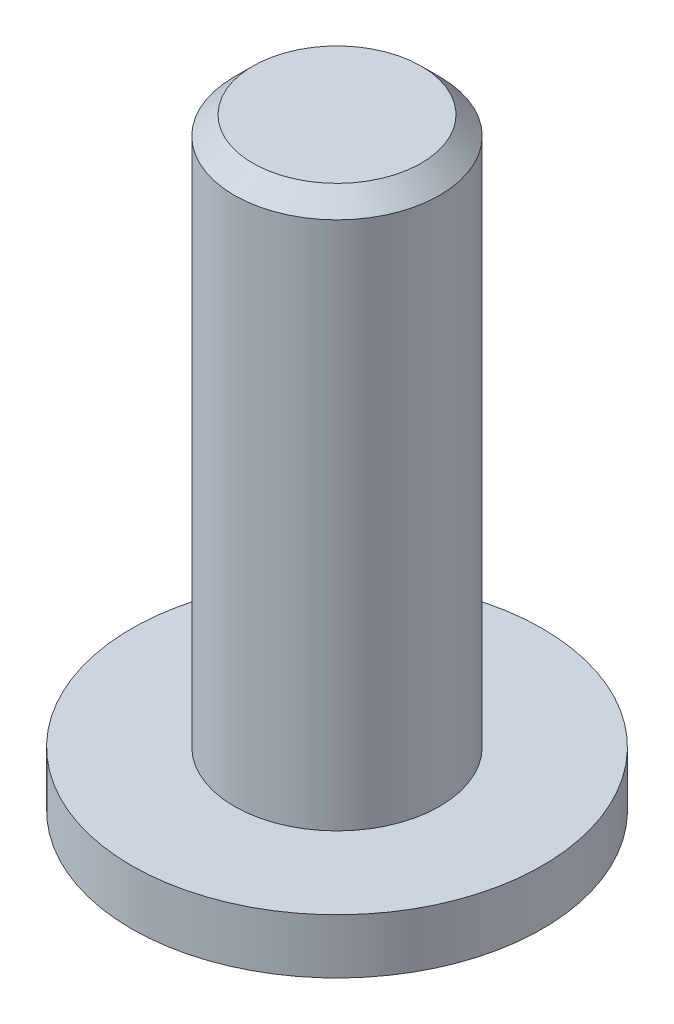
ISO-10303-21;
HEADER;
FILE_DESCRIPTION(('STEP AP214'),'2;1');
FILE_NAME('part.step','',(''),(''),'','','');
FILE_SCHEMA(('AUTOMOTIVE_DESIGN { 1 0 10303 214 1 1 1 1 }'));
ENDSEC;
DATA;
#1=APPLICATION_CONTEXT('core data for automotive mechanical design processes');
#2=APPLICATION_PROTOCOL_DEFINITION('international standard','automotive_design',2000,#1);
#3=PRODUCT_CONTEXT('',#1,'mechanical');
#4=PRODUCT('Part','Part','',(#3));
#5=PRODUCT_RELATED_PRODUCT_CATEGORY('part','',(#4));
#6=PRODUCT_DEFINITION_FORMATION('','',#4);
#7=PRODUCT_DEFINITION_CONTEXT('part definition',#1,'design');
#8=PRODUCT_DEFINITION('design','',#6,#7);
#9=PRODUCT_DEFINITION_SHAPE('','',#8);
#10=(LENGTH_UNIT() NAMED_UNIT(*) SI_UNIT(.MILLI.,.METRE.));
#11=(NAMED_UNIT(*) PLANE_ANGLE_UNIT() SI_UNIT($,.RADIAN.));
#12=(NAMED_UNIT(*) SI_UNIT($,.STERADIAN.) SOLID_ANGLE_UNIT());
#13=UNCERTAINTY_MEASURE_WITH_UNIT(LENGTH_MEASURE(1.E-05),#10,'distance_accuracy_value','');
#14=(GEOMETRIC_REPRESENTATION_CONTEXT(3) GLOBAL_UNCERTAINTY_ASSIGNED_CONTEXT((#13)) GLOBAL_UNIT_ASSIGNED_CONTEXT((#10,
#11,#12)) REPRESENTATION_CONTEXT('',''));
#15=CARTESIAN_POINT('',(0.,0.,0.));
#16=DIRECTION('',(0.,0.,1.));
#17=DIRECTION('',(1.,0.,0.));
#18=AXIS2_PLACEMENT_3D('',#15,#16,#17);
#19=CARTESIAN_POINT('',(0.,0.8,0.));
#20=DIRECTION('',(0.,-1.,0.));
#21=DIRECTION('',(0.,0.,-1.));
#22=AXIS2_PLACEMENT_3D('',#19,#20,#21);
#23=CYLINDRICAL_SURFACE('',#22,3.);
#24=CARTESIAN_POINT('',(0.,0.8,0.));
#25=DIRECTION('',(0.,1.,0.));
#26=DIRECTION('',(0.,0.,1.));
#27=AXIS2_PLACEMENT_3D('',#24,#25,#26);
#28=CIRCLE('',#27,3.);
#29=CARTESIAN_POINT('',(0.,0.8,3.));
#30=VERTEX_POINT('',#29);
#31=EDGE_CURVE('E11',#30,#30,#28,.T.);
#32=ORIENTED_EDGE('',*,*,#31,.F.);
#33=EDGE_LOOP('',(#32));
#34=FACE_BOUND('',#33,.T.);
#35=CARTESIAN_POINT('',(0.,0.,0.));
#36=DIRECTION('',(0.,1.,0.));
#37=DIRECTION('',(0.,0.,1.));
#38=AXIS2_PLACEMENT_3D('',#35,#36,#37);
#39=CIRCLE('',#38,3.);
#40=CARTESIAN_POINT('',(0.,0.,3.));
#41=VERTEX_POINT('',#40);
#42=EDGE_CURVE('E56',#41,#41,#39,.T.);
#43=ORIENTED_EDGE('',*,*,#42,.T.);
#44=EDGE_LOOP('',(#43));
#45=FACE_BOUND('',#44,.T.);
#46=ADVANCED_FACE('F53',(#34,#45),#23,.T.);
#47=CARTESIAN_POINT('',(0.,0.8,0.));
#48=DIRECTION('',(0.,1.,0.));
#49=DIRECTION('',(0.,0.,1.));
#50=AXIS2_PLACEMENT_3D('',#47,#48,#49);
#51=PLANE('',#50);
#52=CARTESIAN_POINT('',(0.,0.8,0.));
#53=DIRECTION('',(0.,-1.,0.));
#54=DIRECTION('',(0.,0.,-1.));
#55=AXIS2_PLACEMENT_3D('',#52,#53,#54);
#56=CIRCLE('',#55,1.5);
#57=CARTESIAN_POINT('',(0.,0.8,-1.5));
#58=VERTEX_POINT('',#57);
#59=EDGE_CURVE('E167',#58,#58,#56,.T.);
#60=ORIENTED_EDGE('',*,*,#59,.T.);
#61=EDGE_LOOP('',(#60));
#62=FACE_BOUND('',#61,.T.);
#63=ORIENTED_EDGE('',*,*,#31,.T.);
#64=EDGE_LOOP('',(#63));
#65=FACE_BOUND('',#64,.T.);
#66=ADVANCED_FACE('F197',(#62,#65),#51,.T.);
#67=CARTESIAN_POINT('',(0.,0.,0.));
#68=DIRECTION('',(0.,1.,0.));
#69=DIRECTION('',(0.,0.,1.));
#70=AXIS2_PLACEMENT_3D('',#67,#68,#69);
#71=PLANE('',#70);
#72=DIRECTION('',(-0.5,0.,0.866025403784438));
#73=VECTOR('',#72,1.);
#74=CARTESIAN_POINT('',(1.15470053837925,0.,0.));
#75=LINE('',#74,#73);
#76=CARTESIAN_POINT('',(1.15470053837925,0.,0.));
#77=VERTEX_POINT('',#76);
#78=CARTESIAN_POINT('',(0.577350269189625,0.,1.));
#79=VERTEX_POINT('',#78);
#80=EDGE_CURVE('E148',#77,#79,#75,.T.);
#81=ORIENTED_EDGE('',*,*,#80,.F.);
#82=DIRECTION('',(0.5,0.,0.866025403784439));
#83=VECTOR('',#82,1.);
#84=CARTESIAN_POINT('',(0.577350269189626,0.,-1.));
#85=LINE('',#84,#83);
#86=CARTESIAN_POINT('',(0.577350269189626,0.,-1.));
#87=VERTEX_POINT('',#86);
#88=EDGE_CURVE('E68',#87,#77,#85,.T.);
#89=ORIENTED_EDGE('',*,*,#88,.F.);
#90=DIRECTION('',(1.,0.,0.));
#91=VECTOR('',#90,1.);
#92=CARTESIAN_POINT('',(-0.577350269189626,0.,-1.));
#93=LINE('',#92,#91);
#94=CARTESIAN_POINT('',(-0.577350269189626,0.,-1.));
#95=VERTEX_POINT('',#94);
#96=EDGE_CURVE('E161',#95,#87,#93,.T.);
#97=ORIENTED_EDGE('',*,*,#96,.F.);
#98=DIRECTION('',(0.5,0.,-0.866025403784439));
#99=VECTOR('',#98,1.);
#100=CARTESIAN_POINT('',(-1.15470053837925,0.,0.));
#101=LINE('',#100,#99);
#102=CARTESIAN_POINT('',(-1.15470053837925,0.,0.));
#103=VERTEX_POINT('',#102);
#104=EDGE_CURVE('E158',#103,#95,#101,.T.);
#105=ORIENTED_EDGE('',*,*,#104,.F.);
#106=DIRECTION('',(-0.5,0.,-0.866025403784439));
#107=VECTOR('',#106,1.);
#108=CARTESIAN_POINT('',(-0.577350269189626,0.,1.));
#109=LINE('',#108,#107);
#110=CARTESIAN_POINT('',(-0.577350269189626,0.,1.));
#111=VERTEX_POINT('',#110);
#112=EDGE_CURVE('E116',#111,#103,#109,.T.);
#113=ORIENTED_EDGE('',*,*,#112,.F.);
#114=DIRECTION('',(-1.,0.,0.));
#115=VECTOR('',#114,1.);
#116=CARTESIAN_POINT('',(0.577350269189625,0.,1.));
#117=LINE('',#116,#115);
#118=EDGE_CURVE('E152',#79,#111,#117,.T.);
#119=ORIENTED_EDGE('',*,*,#118,.F.);
#120=EDGE_LOOP('',(#81,#89,#97,#105,#113,#119));
#121=FACE_BOUND('',#120,.T.);
#122=ORIENTED_EDGE('',*,*,#42,.F.);
#123=EDGE_LOOP('',(#122));
#124=FACE_BOUND('',#123,.T.);
#125=ADVANCED_FACE('F194',(#121,#124),#71,.F.);
#126=CARTESIAN_POINT('',(1.2295,8.8,0.));
#127=DIRECTION('',(0.,1.,0.));
#128=DIRECTION('',(0.,0.,1.));
#129=AXIS2_PLACEMENT_3D('',#126,#127,#128);
#130=PLANE('',#129);
#131=CARTESIAN_POINT('',(0.,8.8,0.));
#132=DIRECTION('',(0.,-1.,0.));
#133=DIRECTION('',(0.,0.,-1.));
#134=AXIS2_PLACEMENT_3D('',#131,#132,#133);
#135=CIRCLE('',#134,1.2295);
#136=CARTESIAN_POINT('',(0.,8.8,-1.2295));
#137=VERTEX_POINT('',#136);
#138=EDGE_CURVE('E184',#137,#137,#135,.T.);
#139=ORIENTED_EDGE('',*,*,#138,.F.);
#140=EDGE_LOOP('',(#139));
#141=FACE_BOUND('',#140,.T.);
#142=ADVANCED_FACE('F196',(#141),#130,.T.);
#143=CARTESIAN_POINT('',(0.,8.5295,0.));
#144=DIRECTION('',(0.,-1.,0.));
#145=DIRECTION('',(0.,0.,-1.));
#146=AXIS2_PLACEMENT_3D('',#143,#144,#145);
#147=CONICAL_SURFACE('',#146,1.5,0.78539816339745);
#148=ORIENTED_EDGE('',*,*,#138,.T.);
#149=EDGE_LOOP('',(#148));
#150=FACE_BOUND('',#149,.T.);
#151=CARTESIAN_POINT('',(0.,8.5295,0.));
#152=DIRECTION('',(0.,-1.,0.));
#153=DIRECTION('',(0.,0.,-1.));
#154=AXIS2_PLACEMENT_3D('',#151,#152,#153);
#155=CIRCLE('',#154,1.5);
#156=CARTESIAN_POINT('',(0.,8.5295,-1.5));
#157=VERTEX_POINT('',#156);
#158=EDGE_CURVE('E180',#157,#157,#155,.T.);
#159=ORIENTED_EDGE('',*,*,#158,.F.);
#160=EDGE_LOOP('',(#159));
#161=FACE_BOUND('',#160,.T.);
#162=ADVANCED_FACE('F204',(#150,#161),#147,.T.);
#163=CARTESIAN_POINT('',(0.,0.8,0.));
#164=DIRECTION('',(0.,-1.,0.));
#165=DIRECTION('',(0.,0.,-1.));
#166=AXIS2_PLACEMENT_3D('',#163,#164,#165);
#167=CYLINDRICAL_SURFACE('',#166,1.5);
#168=ORIENTED_EDGE('',*,*,#158,.T.);
#169=EDGE_LOOP('',(#168));
#170=FACE_BOUND('',#169,.T.);
#171=ORIENTED_EDGE('',*,*,#59,.F.);
#172=EDGE_LOOP('',(#171));
#173=FACE_BOUND('',#172,.T.);
#174=ADVANCED_FACE('F237',(#170,#173),#167,.T.);
#175=CARTESIAN_POINT('',(0.577350269189626,0.5,-1.));
#176=DIRECTION('',(0.866025403784439,0.,-0.5));
#177=DIRECTION('',(-0.5,0.,-0.866025403784439));
#178=AXIS2_PLACEMENT_3D('',#175,#176,#177);
#179=PLANE('',#178);
#180=ORIENTED_EDGE('',*,*,#88,.T.);
#181=DIRECTION('',(0.,-1.,0.));
#182=VECTOR('',#181,1.);
#183=CARTESIAN_POINT('',(1.15470053837925,0.5,0.));
#184=LINE('',#183,#182);
#185=CARTESIAN_POINT('',(1.15470053837925,0.5,0.));
#186=VERTEX_POINT('',#185);
#187=EDGE_CURVE('E98',#186,#77,#184,.T.);
#188=ORIENTED_EDGE('',*,*,#187,.F.);
#189=DIRECTION('',(0.5,0.,0.866025403784439));
#190=VECTOR('',#189,1.);
#191=CARTESIAN_POINT('',(0.577350269189626,0.5,-1.));
#192=LINE('',#191,#190);
#193=CARTESIAN_POINT('',(0.577350269189626,0.5,-1.));
#194=VERTEX_POINT('',#193);
#195=EDGE_CURVE('E164',#194,#186,#192,.T.);
#196=ORIENTED_EDGE('',*,*,#195,.F.);
#197=DIRECTION('',(0.,-1.,0.));
#198=VECTOR('',#197,1.);
#199=CARTESIAN_POINT('',(0.577350269189626,0.5,-1.));
#200=LINE('',#199,#198);
#201=EDGE_CURVE('E76',#194,#87,#200,.T.);
#202=ORIENTED_EDGE('',*,*,#201,.T.);
#203=EDGE_LOOP('',(#180,#188,#196,#202));
#204=FACE_BOUND('',#203,.T.);
#205=ADVANCED_FACE('F248',(#204),#179,.F.);
#206=CARTESIAN_POINT('',(-0.577350269189626,0.5,-1.));
#207=DIRECTION('',(0.,0.,-1.));
#208=DIRECTION('',(-1.,0.,0.));
#209=AXIS2_PLACEMENT_3D('',#206,#207,#208);
#210=PLANE('',#209);
#211=ORIENTED_EDGE('',*,*,#96,.T.);
#212=ORIENTED_EDGE('',*,*,#201,.F.);
#213=DIRECTION('',(1.,0.,0.));
#214=VECTOR('',#213,1.);
#215=CARTESIAN_POINT('',(-0.577350269189626,0.5,-1.));
#216=LINE('',#215,#214);
#217=CARTESIAN_POINT('',(-0.577350269189626,0.5,-1.));
#218=VERTEX_POINT('',#217);
#219=EDGE_CURVE('E130',#218,#194,#216,.T.);
#220=ORIENTED_EDGE('',*,*,#219,.F.);
#221=DIRECTION('',(0.,-1.,0.));
#222=VECTOR('',#221,1.);
#223=CARTESIAN_POINT('',(-0.577350269189626,0.5,-1.));
#224=LINE('',#223,#222);
#225=EDGE_CURVE('E121',#218,#95,#224,.T.);
#226=ORIENTED_EDGE('',*,*,#225,.T.);
#227=EDGE_LOOP('',(#211,#212,#220,#226));
#228=FACE_BOUND('',#227,.T.);
#229=ADVANCED_FACE('F264',(#228),#210,.F.);
#230=CARTESIAN_POINT('',(-1.15470053837925,0.5,0.));
#231=DIRECTION('',(-0.866025403784439,0.,-0.5));
#232=DIRECTION('',(-0.5,0.,0.866025403784439));
#233=AXIS2_PLACEMENT_3D('',#230,#231,#232);
#234=PLANE('',#233);
#235=ORIENTED_EDGE('',*,*,#104,.T.);
#236=ORIENTED_EDGE('',*,*,#225,.F.);
#237=DIRECTION('',(0.5,0.,-0.866025403784439));
#238=VECTOR('',#237,1.);
#239=CARTESIAN_POINT('',(-1.15470053837925,0.5,0.));
#240=LINE('',#239,#238);
#241=CARTESIAN_POINT('',(-1.15470053837925,0.5,0.));
#242=VERTEX_POINT('',#241);
#243=EDGE_CURVE('E125',#242,#218,#240,.T.);
#244=ORIENTED_EDGE('',*,*,#243,.F.);
#245=DIRECTION('',(0.,-1.,0.));
#246=VECTOR('',#245,1.);
#247=CARTESIAN_POINT('',(-1.15470053837925,0.5,0.));
#248=LINE('',#247,#246);
#249=EDGE_CURVE('E109',#242,#103,#248,.T.);
#250=ORIENTED_EDGE('',*,*,#249,.T.);
#251=EDGE_LOOP('',(#235,#236,#244,#250));
#252=FACE_BOUND('',#251,.T.);
#253=ADVANCED_FACE('F126',(#252),#234,.F.);
#254=CARTESIAN_POINT('',(-0.577350269189626,0.5,1.));
#255=DIRECTION('',(-0.866025403784439,0.,0.5));
#256=DIRECTION('',(0.5,0.,0.866025403784439));
#257=AXIS2_PLACEMENT_3D('',#254,#255,#256);
#258=PLANE('',#257);
#259=ORIENTED_EDGE('',*,*,#112,.T.);
#260=ORIENTED_EDGE('',*,*,#249,.F.);
#261=DIRECTION('',(-0.5,0.,-0.866025403784439));
#262=VECTOR('',#261,1.);
#263=CARTESIAN_POINT('',(-0.577350269189626,0.5,1.));
#264=LINE('',#263,#262);
#265=CARTESIAN_POINT('',(-0.577350269189626,0.5,1.));
#266=VERTEX_POINT('',#265);
#267=EDGE_CURVE('E113',#266,#242,#264,.T.);
#268=ORIENTED_EDGE('',*,*,#267,.F.);
#269=DIRECTION('',(0.,-1.,0.));
#270=VECTOR('',#269,1.);
#271=CARTESIAN_POINT('',(-0.577350269189626,0.5,1.));
#272=LINE('',#271,#270);
#273=EDGE_CURVE('E122',#266,#111,#272,.T.);
#274=ORIENTED_EDGE('',*,*,#273,.T.);
#275=EDGE_LOOP('',(#259,#260,#268,#274));
#276=FACE_BOUND('',#275,.T.);
#277=ADVANCED_FACE('F111',(#276),#258,.F.);
#278=CARTESIAN_POINT('',(0.577350269189625,0.5,1.));
#279=DIRECTION('',(0.,0.,1.));
#280=DIRECTION('',(1.,0.,0.));
#281=AXIS2_PLACEMENT_3D('',#278,#279,#280);
#282=PLANE('',#281);
#283=ORIENTED_EDGE('',*,*,#118,.T.);
#284=ORIENTED_EDGE('',*,*,#273,.F.);
#285=DIRECTION('',(-1.,0.,0.));
#286=VECTOR('',#285,1.);
#287=CARTESIAN_POINT('',(0.577350269189625,0.5,1.));
#288=LINE('',#287,#286);
#289=CARTESIAN_POINT('',(0.577350269189625,0.5,1.));
#290=VERTEX_POINT('',#289);
#291=EDGE_CURVE('E136',#290,#266,#288,.T.);
#292=ORIENTED_EDGE('',*,*,#291,.F.);
#293=DIRECTION('',(0.,-1.,0.));
#294=VECTOR('',#293,1.);
#295=CARTESIAN_POINT('',(0.577350269189625,0.5,1.));
#296=LINE('',#295,#294);
#297=EDGE_CURVE('E172',#290,#79,#296,.T.);
#298=ORIENTED_EDGE('',*,*,#297,.T.);
#299=EDGE_LOOP('',(#283,#284,#292,#298));
#300=FACE_BOUND('',#299,.T.);
#301=ADVANCED_FACE('F289',(#300),#282,.F.);
#302=CARTESIAN_POINT('',(1.15470053837925,0.5,0.));
#303=DIRECTION('',(0.866025403784439,0.,0.5));
#304=DIRECTION('',(0.5,0.,-0.866025403784438));
#305=AXIS2_PLACEMENT_3D('',#302,#303,#304);
#306=PLANE('',#305);
#307=ORIENTED_EDGE('',*,*,#80,.T.);
#308=ORIENTED_EDGE('',*,*,#297,.F.);
#309=DIRECTION('',(-0.5,0.,0.866025403784438));
#310=VECTOR('',#309,1.);
#311=CARTESIAN_POINT('',(1.15470053837925,0.5,0.));
#312=LINE('',#311,#310);
#313=EDGE_CURVE('E140',#186,#290,#312,.T.);
#314=ORIENTED_EDGE('',*,*,#313,.F.);
#315=ORIENTED_EDGE('',*,*,#187,.T.);
#316=EDGE_LOOP('',(#307,#308,#314,#315));
#317=FACE_BOUND('',#316,.T.);
#318=ADVANCED_FACE('F298',(#317),#306,.F.);
#319=CARTESIAN_POINT('',(0.,0.5,0.));
#320=DIRECTION('',(0.,-1.,0.));
#321=DIRECTION('',(0.,0.,-1.));
#322=AXIS2_PLACEMENT_3D('',#319,#320,#321);
#323=PLANE('',#322);
#324=ORIENTED_EDGE('',*,*,#195,.T.);
#325=ORIENTED_EDGE('',*,*,#313,.T.);
#326=ORIENTED_EDGE('',*,*,#291,.T.);
#327=ORIENTED_EDGE('',*,*,#267,.T.);
#328=ORIENTED_EDGE('',*,*,#243,.T.);
#329=ORIENTED_EDGE('',*,*,#219,.T.);
#330=EDGE_LOOP('',(#324,#325,#326,#327,#328,#329));
#331=FACE_BOUND('',#330,.T.);
#332=ADVANCED_FACE('F133',(#331),#323,.T.);
#333=CLOSED_SHELL('',(#46,#66,#125,#142,#162,#174,#205,#229,#253,#277,#301,#318,#332));
#334=MANIFOLD_SOLID_BREP('B2',#333);
#335=ADVANCED_BREP_SHAPE_REPRESENTATION('',(#18,#334),#14);
#336=SHAPE_DEFINITION_REPRESENTATION(#9,#335);
ENDSEC;
END-ISO-10303-21;
